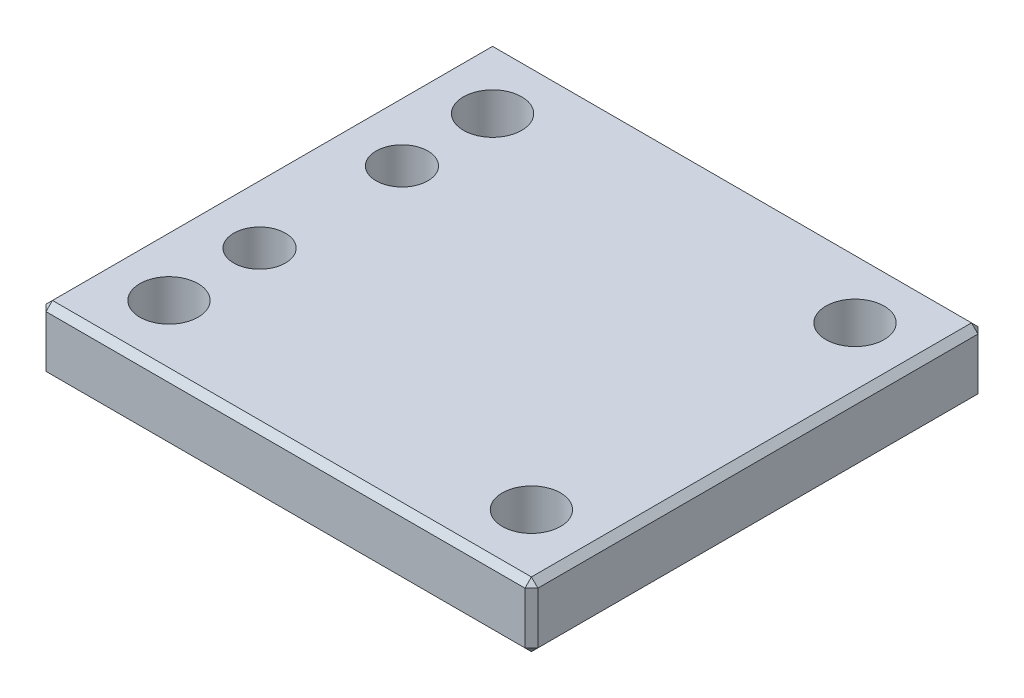
ISO-10303-21;
HEADER;
FILE_DESCRIPTION(('STEP AP214'),'2;1');
FILE_NAME('part.step','',(''),(''),'','','');
FILE_SCHEMA(('AUTOMOTIVE_DESIGN { 1 0 10303 214 1 1 1 1 }'));
ENDSEC;
DATA;
#1=APPLICATION_CONTEXT('core data for automotive mechanical design processes');
#2=APPLICATION_PROTOCOL_DEFINITION('international standard','automotive_design',2000,#1);
#3=PRODUCT_CONTEXT('',#1,'mechanical');
#4=PRODUCT('Part','Part','',(#3));
#5=PRODUCT_RELATED_PRODUCT_CATEGORY('part','',(#4));
#6=PRODUCT_DEFINITION_FORMATION('','',#4);
#7=PRODUCT_DEFINITION_CONTEXT('part definition',#1,'design');
#8=PRODUCT_DEFINITION('design','',#6,#7);
#9=PRODUCT_DEFINITION_SHAPE('','',#8);
#10=(LENGTH_UNIT() NAMED_UNIT(*) SI_UNIT(.MILLI.,.METRE.));
#11=(NAMED_UNIT(*) PLANE_ANGLE_UNIT() SI_UNIT($,.RADIAN.));
#12=(NAMED_UNIT(*) SI_UNIT($,.STERADIAN.) SOLID_ANGLE_UNIT());
#13=UNCERTAINTY_MEASURE_WITH_UNIT(LENGTH_MEASURE(1.E-05),#10,'distance_accuracy_value','');
#14=(GEOMETRIC_REPRESENTATION_CONTEXT(3) GLOBAL_UNCERTAINTY_ASSIGNED_CONTEXT((#13)) GLOBAL_UNIT_ASSIGNED_CONTEXT((#10,
#11,#12)) REPRESENTATION_CONTEXT('',''));
#15=CARTESIAN_POINT('',(0.,0.,0.));
#16=DIRECTION('',(0.,0.,1.));
#17=DIRECTION('',(1.,0.,0.));
#18=AXIS2_PLACEMENT_3D('',#15,#16,#17);
#19=CARTESIAN_POINT('',(0.,5.,0.));
#20=DIRECTION('',(1.,0.,0.));
#21=DIRECTION('',(0.,0.,-1.));
#22=AXIS2_PLACEMENT_3D('',#19,#20,#21);
#23=PLANE('',#22);
#24=DIRECTION('',(0.,-1.,0.));
#25=VECTOR('',#24,1.);
#26=CARTESIAN_POINT('',(0.,5.,-34.5));
#27=LINE('',#26,#25);
#28=CARTESIAN_POINT('',(0.,4.5,-34.5));
#29=VERTEX_POINT('',#28);
#30=CARTESIAN_POINT('',(0.,0.5,-34.5));
#31=VERTEX_POINT('',#30);
#32=EDGE_CURVE('E144',#29,#31,#27,.T.);
#33=ORIENTED_EDGE('',*,*,#32,.T.);
#34=DIRECTION('',(0.,0.,1.));
#35=VECTOR('',#34,1.);
#36=CARTESIAN_POINT('',(0.,0.5,0.));
#37=LINE('',#36,#35);
#38=CARTESIAN_POINT('',(0.,0.5,-0.5));
#39=VERTEX_POINT('',#38);
#40=EDGE_CURVE('E185',#31,#39,#37,.T.);
#41=ORIENTED_EDGE('',*,*,#40,.T.);
#42=DIRECTION('',(0.,1.,0.));
#43=VECTOR('',#42,1.);
#44=CARTESIAN_POINT('',(0.,5.,-0.5));
#45=LINE('',#44,#43);
#46=CARTESIAN_POINT('',(0.,4.5,-0.5));
#47=VERTEX_POINT('',#46);
#48=EDGE_CURVE('E182',#39,#47,#45,.T.);
#49=ORIENTED_EDGE('',*,*,#48,.T.);
#50=DIRECTION('',(0.,0.,-1.));
#51=VECTOR('',#50,1.);
#52=CARTESIAN_POINT('',(0.,4.5,0.));
#53=LINE('',#52,#51);
#54=EDGE_CURVE('E180',#47,#29,#53,.T.);
#55=ORIENTED_EDGE('',*,*,#54,.T.);
#56=EDGE_LOOP('',(#33,#41,#49,#55));
#57=FACE_BOUND('',#56,.T.);
#58=ADVANCED_FACE('F36',(#57),#23,.F.);
#59=CARTESIAN_POINT('',(0.,5.,0.));
#60=DIRECTION('',(0.,0.,-1.));
#61=DIRECTION('',(-1.,0.,0.));
#62=AXIS2_PLACEMENT_3D('',#59,#60,#61);
#63=PLANE('',#62);
#64=DIRECTION('',(-1.,0.,0.));
#65=VECTOR('',#64,1.);
#66=CARTESIAN_POINT('',(0.,4.5,0.));
#67=LINE('',#66,#65);
#68=CARTESIAN_POINT('',(37.5,4.5,0.));
#69=VERTEX_POINT('',#68);
#70=CARTESIAN_POINT('',(0.499999999999994,4.5,0.));
#71=VERTEX_POINT('',#70);
#72=EDGE_CURVE('E187',#69,#71,#67,.T.);
#73=ORIENTED_EDGE('',*,*,#72,.T.);
#74=DIRECTION('',(0.,-1.,0.));
#75=VECTOR('',#74,1.);
#76=CARTESIAN_POINT('',(0.499999999999994,5.,0.));
#77=LINE('',#76,#75);
#78=CARTESIAN_POINT('',(0.499999999999994,0.499999999999994,0.));
#79=VERTEX_POINT('',#78);
#80=EDGE_CURVE('E193',#71,#79,#77,.T.);
#81=ORIENTED_EDGE('',*,*,#80,.T.);
#82=DIRECTION('',(1.,0.,0.));
#83=VECTOR('',#82,1.);
#84=CARTESIAN_POINT('',(38.,0.499999999999994,0.));
#85=LINE('',#84,#83);
#86=CARTESIAN_POINT('',(37.5,0.499999999999994,0.));
#87=VERTEX_POINT('',#86);
#88=EDGE_CURVE('E191',#79,#87,#85,.T.);
#89=ORIENTED_EDGE('',*,*,#88,.T.);
#90=DIRECTION('',(0.,1.,0.));
#91=VECTOR('',#90,1.);
#92=CARTESIAN_POINT('',(37.5,5.,0.));
#93=LINE('',#92,#91);
#94=EDGE_CURVE('E189',#87,#69,#93,.T.);
#95=ORIENTED_EDGE('',*,*,#94,.T.);
#96=EDGE_LOOP('',(#73,#81,#89,#95));
#97=FACE_BOUND('',#96,.T.);
#98=ADVANCED_FACE('F300',(#97),#63,.F.);
#99=CARTESIAN_POINT('',(38.,5.,0.));
#100=DIRECTION('',(-1.,0.,0.));
#101=DIRECTION('',(0.,0.,1.));
#102=AXIS2_PLACEMENT_3D('',#99,#100,#101);
#103=PLANE('',#102);
#104=DIRECTION('',(0.,0.,-1.));
#105=VECTOR('',#104,1.);
#106=CARTESIAN_POINT('',(38.,0.499999999999994,-35.));
#107=LINE('',#106,#105);
#108=CARTESIAN_POINT('',(38.,0.499999999999994,-0.499999999999994));
#109=VERTEX_POINT('',#108);
#110=CARTESIAN_POINT('',(38.,0.499999999999994,-34.5));
#111=VERTEX_POINT('',#110);
#112=EDGE_CURVE('E175',#109,#111,#107,.T.);
#113=ORIENTED_EDGE('',*,*,#112,.T.);
#114=DIRECTION('',(0.,1.,0.));
#115=VECTOR('',#114,1.);
#116=CARTESIAN_POINT('',(38.,5.,-34.5));
#117=LINE('',#116,#115);
#118=CARTESIAN_POINT('',(38.,4.5,-34.5));
#119=VERTEX_POINT('',#118);
#120=EDGE_CURVE('E177',#111,#119,#117,.T.);
#121=ORIENTED_EDGE('',*,*,#120,.T.);
#122=DIRECTION('',(0.,0.,1.));
#123=VECTOR('',#122,1.);
#124=CARTESIAN_POINT('',(38.,4.5,0.));
#125=LINE('',#124,#123);
#126=CARTESIAN_POINT('',(38.,4.5,-0.499999999999994));
#127=VERTEX_POINT('',#126);
#128=EDGE_CURVE('E171',#119,#127,#125,.T.);
#129=ORIENTED_EDGE('',*,*,#128,.T.);
#130=DIRECTION('',(0.,-1.,0.));
#131=VECTOR('',#130,1.);
#132=CARTESIAN_POINT('',(38.,5.,-0.499999999999994));
#133=LINE('',#132,#131);
#134=EDGE_CURVE('E173',#127,#109,#133,.T.);
#135=ORIENTED_EDGE('',*,*,#134,.T.);
#136=EDGE_LOOP('',(#113,#121,#129,#135));
#137=FACE_BOUND('',#136,.T.);
#138=ADVANCED_FACE('F291',(#137),#103,.F.);
#139=CARTESIAN_POINT('',(0.,5.,-35.));
#140=DIRECTION('',(0.,0.,1.));
#141=DIRECTION('',(1.,0.,0.));
#142=AXIS2_PLACEMENT_3D('',#139,#140,#141);
#143=PLANE('',#142);
#144=DIRECTION('',(0.,-1.,0.));
#145=VECTOR('',#144,1.);
#146=CARTESIAN_POINT('',(37.5,5.,-35.));
#147=LINE('',#146,#145);
#148=CARTESIAN_POINT('',(37.5,4.5,-35.));
#149=VERTEX_POINT('',#148);
#150=CARTESIAN_POINT('',(37.5,0.499999999999994,-35.));
#151=VERTEX_POINT('',#150);
#152=EDGE_CURVE('E136',#149,#151,#147,.T.);
#153=ORIENTED_EDGE('',*,*,#152,.T.);
#154=DIRECTION('',(-1.,0.,0.));
#155=VECTOR('',#154,1.);
#156=CARTESIAN_POINT('',(0.,0.499999999999994,-35.));
#157=LINE('',#156,#155);
#158=CARTESIAN_POINT('',(0.499999999999994,0.499999999999994,-35.));
#159=VERTEX_POINT('',#158);
#160=EDGE_CURVE('E132',#151,#159,#157,.T.);
#161=ORIENTED_EDGE('',*,*,#160,.T.);
#162=DIRECTION('',(0.,1.,0.));
#163=VECTOR('',#162,1.);
#164=CARTESIAN_POINT('',(0.499999999999994,5.,-35.));
#165=LINE('',#164,#163);
#166=CARTESIAN_POINT('',(0.499999999999994,4.5,-35.));
#167=VERTEX_POINT('',#166);
#168=EDGE_CURVE('E124',#159,#167,#165,.T.);
#169=ORIENTED_EDGE('',*,*,#168,.T.);
#170=DIRECTION('',(1.,0.,0.));
#171=VECTOR('',#170,1.);
#172=CARTESIAN_POINT('',(0.,4.5,-35.));
#173=LINE('',#172,#171);
#174=EDGE_CURVE('E129',#167,#149,#173,.T.);
#175=ORIENTED_EDGE('',*,*,#174,.T.);
#176=EDGE_LOOP('',(#153,#161,#169,#175));
#177=FACE_BOUND('',#176,.T.);
#178=ADVANCED_FACE('F127',(#177),#143,.F.);
#179=CARTESIAN_POINT('',(0.,5.,-35.));
#180=DIRECTION('',(0.,-1.,0.));
#181=DIRECTION('',(0.,0.,-1.));
#182=AXIS2_PLACEMENT_3D('',#179,#180,#181);
#183=PLANE('',#182);
#184=CARTESIAN_POINT('',(5.00000000000653,5.,-22.9999999999998));
#185=DIRECTION('',(0.,-1.,0.));
#186=DIRECTION('',(0.,0.,-1.));
#187=AXIS2_PLACEMENT_3D('',#184,#185,#186);
#188=CIRCLE('',#187,2.);
#189=CARTESIAN_POINT('',(5.00000000000653,5.,-24.9999999999998));
#190=VERTEX_POINT('',#189);
#191=EDGE_CURVE('E658',#190,#190,#188,.T.);
#192=ORIENTED_EDGE('',*,*,#191,.T.);
#193=EDGE_LOOP('',(#192));
#194=FACE_BOUND('',#193,.T.);
#195=CARTESIAN_POINT('',(5.00000000000651,5.,-12.0000000000019));
#196=DIRECTION('',(0.,-1.,0.));
#197=DIRECTION('',(0.,0.,-1.));
#198=AXIS2_PLACEMENT_3D('',#195,#196,#197);
#199=CIRCLE('',#198,2.);
#200=CARTESIAN_POINT('',(5.00000000000651,5.,-14.0000000000019));
#201=VERTEX_POINT('',#200);
#202=EDGE_CURVE('E662',#201,#201,#199,.T.);
#203=ORIENTED_EDGE('',*,*,#202,.T.);
#204=EDGE_LOOP('',(#203));
#205=FACE_BOUND('',#204,.T.);
#206=CARTESIAN_POINT('',(33.,5.,-5.00000000000001));
#207=DIRECTION('',(0.,-1.,0.));
#208=DIRECTION('',(0.,0.,-1.));
#209=AXIS2_PLACEMENT_3D('',#206,#207,#208);
#210=CIRCLE('',#209,2.25);
#211=CARTESIAN_POINT('',(33.,5.,-7.25000000000001));
#212=VERTEX_POINT('',#211);
#213=EDGE_CURVE('E666',#212,#212,#210,.T.);
#214=ORIENTED_EDGE('',*,*,#213,.T.);
#215=EDGE_LOOP('',(#214));
#216=FACE_BOUND('',#215,.T.);
#217=CARTESIAN_POINT('',(33.,5.,-30.));
#218=DIRECTION('',(0.,-1.,0.));
#219=DIRECTION('',(0.,0.,-1.));
#220=AXIS2_PLACEMENT_3D('',#217,#218,#219);
#221=CIRCLE('',#220,2.25);
#222=CARTESIAN_POINT('',(33.,5.,-32.25));
#223=VERTEX_POINT('',#222);
#224=EDGE_CURVE('E670',#223,#223,#221,.T.);
#225=ORIENTED_EDGE('',*,*,#224,.T.);
#226=EDGE_LOOP('',(#225));
#227=FACE_BOUND('',#226,.T.);
#228=CARTESIAN_POINT('',(5.00000000000002,5.,-30.));
#229=DIRECTION('',(0.,-1.,0.));
#230=DIRECTION('',(0.,0.,-1.));
#231=AXIS2_PLACEMENT_3D('',#228,#229,#230);
#232=CIRCLE('',#231,2.25);
#233=CARTESIAN_POINT('',(5.00000000000002,5.,-32.25));
#234=VERTEX_POINT('',#233);
#235=EDGE_CURVE('E674',#234,#234,#232,.T.);
#236=ORIENTED_EDGE('',*,*,#235,.T.);
#237=EDGE_LOOP('',(#236));
#238=FACE_BOUND('',#237,.T.);
#239=CARTESIAN_POINT('',(5.00000000000001,5.,-5.00000000000001));
#240=DIRECTION('',(0.,-1.,0.));
#241=DIRECTION('',(0.,0.,-1.));
#242=AXIS2_PLACEMENT_3D('',#239,#240,#241);
#243=CIRCLE('',#242,2.25);
#244=CARTESIAN_POINT('',(5.00000000000001,5.,-7.25000000000001));
#245=VERTEX_POINT('',#244);
#246=EDGE_CURVE('E212',#245,#245,#243,.T.);
#247=ORIENTED_EDGE('',*,*,#246,.T.);
#248=EDGE_LOOP('',(#247));
#249=FACE_BOUND('',#248,.T.);
#250=DIRECTION('',(0.,0.,-1.));
#251=VECTOR('',#250,1.);
#252=CARTESIAN_POINT('',(37.5,5.,-35.));
#253=LINE('',#252,#251);
#254=CARTESIAN_POINT('',(37.5,5.,-0.499999999999994));
#255=VERTEX_POINT('',#254);
#256=CARTESIAN_POINT('',(37.5,5.,-34.5));
#257=VERTEX_POINT('',#256);
#258=EDGE_CURVE('E45',#255,#257,#253,.T.);
#259=ORIENTED_EDGE('',*,*,#258,.T.);
#260=DIRECTION('',(-1.,0.,0.));
#261=VECTOR('',#260,1.);
#262=CARTESIAN_POINT('',(0.,5.,-34.5));
#263=LINE('',#262,#261);
#264=CARTESIAN_POINT('',(0.499999999999994,5.,-34.5));
#265=VERTEX_POINT('',#264);
#266=EDGE_CURVE('E11',#257,#265,#263,.T.);
#267=ORIENTED_EDGE('',*,*,#266,.T.);
#268=DIRECTION('',(0.,0.,1.));
#269=VECTOR('',#268,1.);
#270=CARTESIAN_POINT('',(0.499999999999994,5.,-35.));
#271=LINE('',#270,#269);
#272=CARTESIAN_POINT('',(0.499999999999994,5.,-0.499999999999994));
#273=VERTEX_POINT('',#272);
#274=EDGE_CURVE('E205',#265,#273,#271,.T.);
#275=ORIENTED_EDGE('',*,*,#274,.T.);
#276=DIRECTION('',(1.,0.,0.));
#277=VECTOR('',#276,1.);
#278=CARTESIAN_POINT('',(0.,5.,-0.499999999999994));
#279=LINE('',#278,#277);
#280=EDGE_CURVE('E56',#273,#255,#279,.T.);
#281=ORIENTED_EDGE('',*,*,#280,.T.);
#282=EDGE_LOOP('',(#259,#267,#275,#281));
#283=FACE_BOUND('',#282,.T.);
#284=ADVANCED_FACE('F313',(#194,#205,#216,#227,#238,#249,#283),#183,.F.);
#285=CARTESIAN_POINT('',(0.,0.,-35.));
#286=DIRECTION('',(0.,-1.,0.));
#287=DIRECTION('',(0.,0.,-1.));
#288=AXIS2_PLACEMENT_3D('',#285,#286,#287);
#289=PLANE('',#288);
#290=CARTESIAN_POINT('',(5.00000000000653,0.,-22.9999999999998));
#291=DIRECTION('',(0.,-1.,0.));
#292=DIRECTION('',(0.,0.,-1.));
#293=AXIS2_PLACEMENT_3D('',#290,#291,#292);
#294=CIRCLE('',#293,2.);
#295=CARTESIAN_POINT('',(5.00000000000653,0.,-24.9999999999998));
#296=VERTEX_POINT('',#295);
#297=EDGE_CURVE('E695',#296,#296,#294,.T.);
#298=ORIENTED_EDGE('',*,*,#297,.F.);
#299=EDGE_LOOP('',(#298));
#300=FACE_BOUND('',#299,.T.);
#301=CARTESIAN_POINT('',(5.00000000000651,0.,-12.0000000000019));
#302=DIRECTION('',(0.,-1.,0.));
#303=DIRECTION('',(0.,0.,-1.));
#304=AXIS2_PLACEMENT_3D('',#301,#302,#303);
#305=CIRCLE('',#304,2.);
#306=CARTESIAN_POINT('',(5.00000000000651,0.,-14.0000000000019));
#307=VERTEX_POINT('',#306);
#308=EDGE_CURVE('E691',#307,#307,#305,.T.);
#309=ORIENTED_EDGE('',*,*,#308,.F.);
#310=EDGE_LOOP('',(#309));
#311=FACE_BOUND('',#310,.T.);
#312=CARTESIAN_POINT('',(33.,0.,-5.00000000000001));
#313=DIRECTION('',(0.,-1.,0.));
#314=DIRECTION('',(0.,0.,-1.));
#315=AXIS2_PLACEMENT_3D('',#312,#313,#314);
#316=CIRCLE('',#315,2.25);
#317=CARTESIAN_POINT('',(33.,0.,-7.25000000000001));
#318=VERTEX_POINT('',#317);
#319=EDGE_CURVE('E687',#318,#318,#316,.T.);
#320=ORIENTED_EDGE('',*,*,#319,.F.);
#321=EDGE_LOOP('',(#320));
#322=FACE_BOUND('',#321,.T.);
#323=CARTESIAN_POINT('',(33.,0.,-30.));
#324=DIRECTION('',(0.,-1.,0.));
#325=DIRECTION('',(0.,0.,-1.));
#326=AXIS2_PLACEMENT_3D('',#323,#324,#325);
#327=CIRCLE('',#326,2.25);
#328=CARTESIAN_POINT('',(33.,0.,-32.25));
#329=VERTEX_POINT('',#328);
#330=EDGE_CURVE('E683',#329,#329,#327,.T.);
#331=ORIENTED_EDGE('',*,*,#330,.F.);
#332=EDGE_LOOP('',(#331));
#333=FACE_BOUND('',#332,.T.);
#334=CARTESIAN_POINT('',(5.00000000000002,0.,-30.));
#335=DIRECTION('',(0.,-1.,0.));
#336=DIRECTION('',(0.,0.,-1.));
#337=AXIS2_PLACEMENT_3D('',#334,#335,#336);
#338=CIRCLE('',#337,2.25);
#339=CARTESIAN_POINT('',(5.00000000000002,0.,-32.25));
#340=VERTEX_POINT('',#339);
#341=EDGE_CURVE('E679',#340,#340,#338,.T.);
#342=ORIENTED_EDGE('',*,*,#341,.F.);
#343=EDGE_LOOP('',(#342));
#344=FACE_BOUND('',#343,.T.);
#345=CARTESIAN_POINT('',(5.00000000000001,0.,-5.00000000000001));
#346=DIRECTION('',(0.,-1.,0.));
#347=DIRECTION('',(0.,0.,-1.));
#348=AXIS2_PLACEMENT_3D('',#345,#346,#347);
#349=CIRCLE('',#348,2.25);
#350=CARTESIAN_POINT('',(5.00000000000001,0.,-7.25000000000001));
#351=VERTEX_POINT('',#350);
#352=EDGE_CURVE('E166',#351,#351,#349,.T.);
#353=ORIENTED_EDGE('',*,*,#352,.F.);
#354=EDGE_LOOP('',(#353));
#355=FACE_BOUND('',#354,.T.);
#356=DIRECTION('',(0.,0.,1.));
#357=VECTOR('',#356,1.);
#358=CARTESIAN_POINT('',(37.5,0.,0.));
#359=LINE('',#358,#357);
#360=CARTESIAN_POINT('',(37.5,0.,-34.5));
#361=VERTEX_POINT('',#360);
#362=CARTESIAN_POINT('',(37.5,0.,-0.5));
#363=VERTEX_POINT('',#362);
#364=EDGE_CURVE('E196',#361,#363,#359,.T.);
#365=ORIENTED_EDGE('',*,*,#364,.T.);
#366=DIRECTION('',(-1.,0.,0.));
#367=VECTOR('',#366,1.);
#368=CARTESIAN_POINT('',(0.,0.,-0.5));
#369=LINE('',#368,#367);
#370=CARTESIAN_POINT('',(0.499999999999994,0.,-0.5));
#371=VERTEX_POINT('',#370);
#372=EDGE_CURVE('E202',#363,#371,#369,.T.);
#373=ORIENTED_EDGE('',*,*,#372,.T.);
#374=DIRECTION('',(0.,0.,-1.));
#375=VECTOR('',#374,1.);
#376=CARTESIAN_POINT('',(0.499999999999994,0.,-35.));
#377=LINE('',#376,#375);
#378=CARTESIAN_POINT('',(0.499999999999994,0.,-34.5));
#379=VERTEX_POINT('',#378);
#380=EDGE_CURVE('E200',#371,#379,#377,.T.);
#381=ORIENTED_EDGE('',*,*,#380,.T.);
#382=DIRECTION('',(1.,0.,0.));
#383=VECTOR('',#382,1.);
#384=CARTESIAN_POINT('',(38.,0.,-34.5));
#385=LINE('',#384,#383);
#386=EDGE_CURVE('E198',#379,#361,#385,.T.);
#387=ORIENTED_EDGE('',*,*,#386,.T.);
#388=EDGE_LOOP('',(#365,#373,#381,#387));
#389=FACE_BOUND('',#388,.T.);
#390=ADVANCED_FACE('F273',(#300,#311,#322,#333,#344,#355,#389),#289,.T.);
#391=CARTESIAN_POINT('',(0.499999999999994,5.,0.));
#392=DIRECTION('',(0.707106781186552,0.,-0.707106781186543));
#393=DIRECTION('',(-0.707106781186543,0.,-0.707106781186552));
#394=AXIS2_PLACEMENT_3D('',#391,#392,#393);
#395=PLANE('',#394);
#396=DIRECTION('',(-0.707106781186543,0.,-0.707106781186552));
#397=VECTOR('',#396,1.);
#398=CARTESIAN_POINT('',(0.,4.5,-0.5));
#399=LINE('',#398,#397);
#400=EDGE_CURVE('E40',#47,#71,#399,.F.);
#401=ORIENTED_EDGE('',*,*,#400,.F.);
#402=ORIENTED_EDGE('',*,*,#48,.F.);
#403=DIRECTION('',(0.707106781186543,0.,0.707106781186552));
#404=VECTOR('',#403,1.);
#405=CARTESIAN_POINT('',(0.499999999999994,0.499999999999994,0.));
#406=LINE('',#405,#404);
#407=EDGE_CURVE('E164',#79,#39,#406,.F.);
#408=ORIENTED_EDGE('',*,*,#407,.F.);
#409=ORIENTED_EDGE('',*,*,#80,.F.);
#410=EDGE_LOOP('',(#401,#402,#408,#409));
#411=FACE_BOUND('',#410,.T.);
#412=ADVANCED_FACE('F38',(#411),#395,.F.);
#413=CARTESIAN_POINT('',(0.,4.5,-0.5));
#414=DIRECTION('',(-0.577350269189634,0.577350269189618,0.577350269189626));
#415=DIRECTION('',(0.707106781186543,0.,0.707106781186552));
#416=AXIS2_PLACEMENT_3D('',#413,#414,#415);
#417=PLANE('',#416);
#418=DIRECTION('',(0.707106781186543,0.707106781186552,0.));
#419=VECTOR('',#418,1.);
#420=CARTESIAN_POINT('',(0.,4.5,-0.5));
#421=LINE('',#420,#419);
#422=EDGE_CURVE('E253',#47,#273,#421,.T.);
#423=ORIENTED_EDGE('',*,*,#422,.F.);
#424=ORIENTED_EDGE('',*,*,#400,.T.);
#425=DIRECTION('',(0.,-0.707106781186552,0.707106781186543));
#426=VECTOR('',#425,1.);
#427=CARTESIAN_POINT('',(0.499999999999994,4.75,-0.249999999999997));
#428=LINE('',#427,#426);
#429=EDGE_CURVE('E256',#273,#71,#428,.T.);
#430=ORIENTED_EDGE('',*,*,#429,.F.);
#431=EDGE_LOOP('',(#423,#424,#430));
#432=FACE_BOUND('',#431,.T.);
#433=ADVANCED_FACE('F307',(#432),#417,.T.);
#434=CARTESIAN_POINT('',(0.499999999999994,0.499999999999994,0.));
#435=DIRECTION('',(-0.577350269189634,-0.577350269189626,0.577350269189618));
#436=DIRECTION('',(0.707106781186543,-0.707106781186552,0.));
#437=AXIS2_PLACEMENT_3D('',#434,#435,#436);
#438=PLANE('',#437);
#439=DIRECTION('',(0.,0.707106781186543,0.707106781186552));
#440=VECTOR('',#439,1.);
#441=CARTESIAN_POINT('',(0.499999999999994,0.499999999999994,0.));
#442=LINE('',#441,#440);
#443=EDGE_CURVE('E247',#79,#371,#442,.F.);
#444=ORIENTED_EDGE('',*,*,#443,.F.);
#445=ORIENTED_EDGE('',*,*,#407,.T.);
#446=DIRECTION('',(0.707106781186543,-0.707106781186552,0.));
#447=VECTOR('',#446,1.);
#448=CARTESIAN_POINT('',(0.249999999999997,0.25,-0.5));
#449=LINE('',#448,#447);
#450=EDGE_CURVE('E250',#371,#39,#449,.F.);
#451=ORIENTED_EDGE('',*,*,#450,.F.);
#452=EDGE_LOOP('',(#444,#445,#451));
#453=FACE_BOUND('',#452,.T.);
#454=ADVANCED_FACE('F263',(#453),#438,.T.);
#455=CARTESIAN_POINT('',(0.,5.,-0.499999999999994));
#456=DIRECTION('',(0.,-0.707106781186543,-0.707106781186552));
#457=DIRECTION('',(0.,0.707106781186552,-0.707106781186543));
#458=AXIS2_PLACEMENT_3D('',#455,#456,#457);
#459=PLANE('',#458);
#460=ORIENTED_EDGE('',*,*,#429,.T.);
#461=ORIENTED_EDGE('',*,*,#72,.F.);
#462=DIRECTION('',(0.,0.707106781186552,-0.707106781186543));
#463=VECTOR('',#462,1.);
#464=CARTESIAN_POINT('',(37.5,4.5,0.));
#465=LINE('',#464,#463);
#466=EDGE_CURVE('E241',#255,#69,#465,.F.);
#467=ORIENTED_EDGE('',*,*,#466,.F.);
#468=ORIENTED_EDGE('',*,*,#280,.F.);
#469=EDGE_LOOP('',(#460,#461,#467,#468));
#470=FACE_BOUND('',#469,.T.);
#471=ADVANCED_FACE('F302',(#470),#459,.F.);
#472=CARTESIAN_POINT('',(0.499999999999994,5.,-35.));
#473=DIRECTION('',(0.707106781186552,-0.707106781186543,0.));
#474=DIRECTION('',(0.707106781186543,0.707106781186552,0.));
#475=AXIS2_PLACEMENT_3D('',#472,#473,#474);
#476=PLANE('',#475);
#477=ORIENTED_EDGE('',*,*,#422,.T.);
#478=ORIENTED_EDGE('',*,*,#274,.F.);
#479=DIRECTION('',(-0.707106781186543,-0.707106781186552,0.));
#480=VECTOR('',#479,1.);
#481=CARTESIAN_POINT('',(0.249999999999997,4.75,-34.5));
#482=LINE('',#481,#480);
#483=EDGE_CURVE('E148',#29,#265,#482,.F.);
#484=ORIENTED_EDGE('',*,*,#483,.F.);
#485=ORIENTED_EDGE('',*,*,#54,.F.);
#486=EDGE_LOOP('',(#477,#478,#484,#485));
#487=FACE_BOUND('',#486,.T.);
#488=ADVANCED_FACE('F312',(#487),#476,.F.);
#489=CARTESIAN_POINT('',(0.,5.,-34.5));
#490=DIRECTION('',(0.707106781186552,0.,0.707106781186543));
#491=DIRECTION('',(0.707106781186543,0.,-0.707106781186552));
#492=AXIS2_PLACEMENT_3D('',#489,#490,#491);
#493=PLANE('',#492);
#494=DIRECTION('',(-0.707106781186543,0.,0.707106781186552));
#495=VECTOR('',#494,1.);
#496=CARTESIAN_POINT('',(0.,0.5,-34.5));
#497=LINE('',#496,#495);
#498=EDGE_CURVE('E149',#31,#159,#497,.F.);
#499=ORIENTED_EDGE('',*,*,#498,.F.);
#500=ORIENTED_EDGE('',*,*,#32,.F.);
#501=DIRECTION('',(0.707106781186543,0.,-0.707106781186552));
#502=VECTOR('',#501,1.);
#503=CARTESIAN_POINT('',(0.499999999999994,4.5,-35.));
#504=LINE('',#503,#502);
#505=EDGE_CURVE('E140',#167,#29,#504,.F.);
#506=ORIENTED_EDGE('',*,*,#505,.F.);
#507=ORIENTED_EDGE('',*,*,#168,.F.);
#508=EDGE_LOOP('',(#499,#500,#506,#507));
#509=FACE_BOUND('',#508,.T.);
#510=ADVANCED_FACE('F142',(#509),#493,.F.);
#511=CARTESIAN_POINT('',(0.,0.5,0.));
#512=DIRECTION('',(-0.707106781186552,-0.707106781186543,0.));
#513=DIRECTION('',(0.707106781186543,-0.707106781186552,0.));
#514=AXIS2_PLACEMENT_3D('',#511,#512,#513);
#515=PLANE('',#514);
#516=ORIENTED_EDGE('',*,*,#450,.T.);
#517=ORIENTED_EDGE('',*,*,#40,.F.);
#518=DIRECTION('',(-0.707106781186543,0.707106781186552,0.));
#519=VECTOR('',#518,1.);
#520=CARTESIAN_POINT('',(0.,0.5,-34.5));
#521=LINE('',#520,#519);
#522=EDGE_CURVE('E237',#379,#31,#521,.T.);
#523=ORIENTED_EDGE('',*,*,#522,.F.);
#524=ORIENTED_EDGE('',*,*,#380,.F.);
#525=EDGE_LOOP('',(#516,#517,#523,#524));
#526=FACE_BOUND('',#525,.T.);
#527=ADVANCED_FACE('F269',(#526),#515,.T.);
#528=CARTESIAN_POINT('',(0.,0.499999999999994,0.));
#529=DIRECTION('',(0.,-0.707106781186552,0.707106781186543));
#530=DIRECTION('',(0.,-0.707106781186543,-0.707106781186552));
#531=AXIS2_PLACEMENT_3D('',#528,#529,#530);
#532=PLANE('',#531);
#533=ORIENTED_EDGE('',*,*,#443,.T.);
#534=ORIENTED_EDGE('',*,*,#372,.F.);
#535=DIRECTION('',(0.,-0.707106781186543,-0.707106781186552));
#536=VECTOR('',#535,1.);
#537=CARTESIAN_POINT('',(37.5,0.499999999999994,0.));
#538=LINE('',#537,#536);
#539=EDGE_CURVE('E234',#87,#363,#538,.T.);
#540=ORIENTED_EDGE('',*,*,#539,.F.);
#541=ORIENTED_EDGE('',*,*,#88,.F.);
#542=EDGE_LOOP('',(#533,#534,#540,#541));
#543=FACE_BOUND('',#542,.T.);
#544=ADVANCED_FACE('F279',(#543),#532,.T.);
#545=CARTESIAN_POINT('',(38.,5.,-0.499999999999994));
#546=DIRECTION('',(-0.707106781186543,0.,-0.707106781186552));
#547=DIRECTION('',(-0.707106781186552,0.,0.707106781186543));
#548=AXIS2_PLACEMENT_3D('',#545,#546,#547);
#549=PLANE('',#548);
#550=DIRECTION('',(-0.707106781186552,0.,0.707106781186543));
#551=VECTOR('',#550,1.);
#552=CARTESIAN_POINT('',(37.5,4.5,0.));
#553=LINE('',#552,#551);
#554=EDGE_CURVE('E244',#69,#127,#553,.F.);
#555=ORIENTED_EDGE('',*,*,#554,.F.);
#556=ORIENTED_EDGE('',*,*,#94,.F.);
#557=DIRECTION('',(0.707106781186552,0.,-0.707106781186543));
#558=VECTOR('',#557,1.);
#559=CARTESIAN_POINT('',(37.5,0.499999999999994,0.));
#560=LINE('',#559,#558);
#561=EDGE_CURVE('E231',#109,#87,#560,.F.);
#562=ORIENTED_EDGE('',*,*,#561,.F.);
#563=ORIENTED_EDGE('',*,*,#134,.F.);
#564=EDGE_LOOP('',(#555,#556,#562,#563));
#565=FACE_BOUND('',#564,.T.);
#566=ADVANCED_FACE('F297',(#565),#549,.F.);
#567=CARTESIAN_POINT('',(37.5,4.5,0.));
#568=DIRECTION('',(0.577350269189626,0.577350269189618,0.577350269189634));
#569=DIRECTION('',(0.707106781186552,0.,-0.707106781186543));
#570=AXIS2_PLACEMENT_3D('',#567,#568,#569);
#571=PLANE('',#570);
#572=ORIENTED_EDGE('',*,*,#466,.T.);
#573=ORIENTED_EDGE('',*,*,#554,.T.);
#574=DIRECTION('',(0.707106781186543,-0.707106781186552,0.));
#575=VECTOR('',#574,1.);
#576=CARTESIAN_POINT('',(37.75,4.75,-0.499999999999994));
#577=LINE('',#576,#575);
#578=EDGE_CURVE('E155',#255,#127,#577,.T.);
#579=ORIENTED_EDGE('',*,*,#578,.F.);
#580=EDGE_LOOP('',(#572,#573,#579));
#581=FACE_BOUND('',#580,.T.);
#582=ADVANCED_FACE('F336',(#581),#571,.T.);
#583=CARTESIAN_POINT('',(0.499999999999994,4.5,-35.));
#584=DIRECTION('',(-0.577350269189634,0.577350269189618,-0.577350269189626));
#585=DIRECTION('',(-0.707106781186543,0.,0.707106781186552));
#586=AXIS2_PLACEMENT_3D('',#583,#584,#585);
#587=PLANE('',#586);
#588=ORIENTED_EDGE('',*,*,#505,.T.);
#589=ORIENTED_EDGE('',*,*,#483,.T.);
#590=DIRECTION('',(0.,0.707106781186552,0.707106781186543));
#591=VECTOR('',#590,1.);
#592=CARTESIAN_POINT('',(0.499999999999994,4.5,-35.));
#593=LINE('',#592,#591);
#594=EDGE_CURVE('E151',#167,#265,#593,.T.);
#595=ORIENTED_EDGE('',*,*,#594,.F.);
#596=EDGE_LOOP('',(#588,#589,#595));
#597=FACE_BOUND('',#596,.T.);
#598=ADVANCED_FACE('F152',(#597),#587,.T.);
#599=CARTESIAN_POINT('',(0.,0.5,-34.5));
#600=DIRECTION('',(-0.577350269189634,-0.577350269189626,-0.577350269189618));
#601=DIRECTION('',(0.707106781186543,-0.707106781186552,0.));
#602=AXIS2_PLACEMENT_3D('',#599,#600,#601);
#603=PLANE('',#602);
#604=ORIENTED_EDGE('',*,*,#522,.T.);
#605=ORIENTED_EDGE('',*,*,#498,.T.);
#606=DIRECTION('',(0.,-0.707106781186543,0.707106781186552));
#607=VECTOR('',#606,1.);
#608=CARTESIAN_POINT('',(0.499999999999994,0.249999999999997,-34.75));
#609=LINE('',#608,#607);
#610=EDGE_CURVE('E156',#379,#159,#609,.F.);
#611=ORIENTED_EDGE('',*,*,#610,.F.);
#612=EDGE_LOOP('',(#604,#605,#611));
#613=FACE_BOUND('',#612,.T.);
#614=ADVANCED_FACE('F328',(#613),#603,.T.);
#615=CARTESIAN_POINT('',(37.5,0.499999999999994,0.));
#616=DIRECTION('',(0.577350269189618,-0.577350269189634,0.577350269189626));
#617=DIRECTION('',(0.,-0.707106781186543,-0.707106781186552));
#618=AXIS2_PLACEMENT_3D('',#615,#616,#617);
#619=PLANE('',#618);
#620=ORIENTED_EDGE('',*,*,#561,.T.);
#621=ORIENTED_EDGE('',*,*,#539,.T.);
#622=DIRECTION('',(0.707106781186552,0.707106781186543,0.));
#623=VECTOR('',#622,1.);
#624=CARTESIAN_POINT('',(37.75,0.249999999999997,-0.499999999999997));
#625=LINE('',#624,#623);
#626=EDGE_CURVE('E224',#109,#363,#625,.F.);
#627=ORIENTED_EDGE('',*,*,#626,.F.);
#628=EDGE_LOOP('',(#620,#621,#627));
#629=FACE_BOUND('',#628,.T.);
#630=ADVANCED_FACE('F282',(#629),#619,.T.);
#631=CARTESIAN_POINT('',(37.5,5.,-35.));
#632=DIRECTION('',(-0.707106781186552,-0.707106781186543,0.));
#633=DIRECTION('',(0.707106781186543,-0.707106781186552,0.));
#634=AXIS2_PLACEMENT_3D('',#631,#632,#633);
#635=PLANE('',#634);
#636=ORIENTED_EDGE('',*,*,#578,.T.);
#637=ORIENTED_EDGE('',*,*,#128,.F.);
#638=DIRECTION('',(-0.707106781186543,0.707106781186552,0.));
#639=VECTOR('',#638,1.);
#640=CARTESIAN_POINT('',(38.,4.5,-34.5));
#641=LINE('',#640,#639);
#642=EDGE_CURVE('E221',#257,#119,#641,.F.);
#643=ORIENTED_EDGE('',*,*,#642,.F.);
#644=ORIENTED_EDGE('',*,*,#258,.F.);
#645=EDGE_LOOP('',(#636,#637,#643,#644));
#646=FACE_BOUND('',#645,.T.);
#647=ADVANCED_FACE('F316',(#646),#635,.F.);
#648=CARTESIAN_POINT('',(0.,5.,-34.5));
#649=DIRECTION('',(0.,-0.707106781186543,0.707106781186552));
#650=DIRECTION('',(0.,-0.707106781186552,-0.707106781186543));
#651=AXIS2_PLACEMENT_3D('',#648,#649,#650);
#652=PLANE('',#651);
#653=ORIENTED_EDGE('',*,*,#594,.T.);
#654=ORIENTED_EDGE('',*,*,#266,.F.);
#655=DIRECTION('',(0.,-0.707106781186552,-0.707106781186543));
#656=VECTOR('',#655,1.);
#657=CARTESIAN_POINT('',(37.5,4.75,-34.75));
#658=LINE('',#657,#656);
#659=EDGE_CURVE('E160',#149,#257,#658,.F.);
#660=ORIENTED_EDGE('',*,*,#659,.F.);
#661=ORIENTED_EDGE('',*,*,#174,.F.);
#662=EDGE_LOOP('',(#653,#654,#660,#661));
#663=FACE_BOUND('',#662,.T.);
#664=ADVANCED_FACE('F158',(#663),#652,.F.);
#665=CARTESIAN_POINT('',(0.,0.499999999999994,-35.));
#666=DIRECTION('',(0.,-0.707106781186552,-0.707106781186543));
#667=DIRECTION('',(0.,0.707106781186543,-0.707106781186552));
#668=AXIS2_PLACEMENT_3D('',#665,#666,#667);
#669=PLANE('',#668);
#670=ORIENTED_EDGE('',*,*,#610,.T.);
#671=ORIENTED_EDGE('',*,*,#160,.F.);
#672=DIRECTION('',(0.,0.707106781186543,-0.707106781186552));
#673=VECTOR('',#672,1.);
#674=CARTESIAN_POINT('',(37.5,0.499999999999994,-35.));
#675=LINE('',#674,#673);
#676=EDGE_CURVE('E217',#361,#151,#675,.T.);
#677=ORIENTED_EDGE('',*,*,#676,.F.);
#678=ORIENTED_EDGE('',*,*,#386,.F.);
#679=EDGE_LOOP('',(#670,#671,#677,#678));
#680=FACE_BOUND('',#679,.T.);
#681=ADVANCED_FACE('F326',(#680),#669,.T.);
#682=CARTESIAN_POINT('',(38.,0.499999999999994,0.));
#683=DIRECTION('',(0.707106781186543,-0.707106781186552,0.));
#684=DIRECTION('',(0.707106781186552,0.707106781186543,0.));
#685=AXIS2_PLACEMENT_3D('',#682,#683,#684);
#686=PLANE('',#685);
#687=ORIENTED_EDGE('',*,*,#626,.T.);
#688=ORIENTED_EDGE('',*,*,#364,.F.);
#689=DIRECTION('',(-0.707106781186552,-0.707106781186543,0.));
#690=VECTOR('',#689,1.);
#691=CARTESIAN_POINT('',(37.75,0.249999999999997,-34.5));
#692=LINE('',#691,#690);
#693=EDGE_CURVE('E214',#111,#361,#692,.T.);
#694=ORIENTED_EDGE('',*,*,#693,.F.);
#695=ORIENTED_EDGE('',*,*,#112,.F.);
#696=EDGE_LOOP('',(#687,#688,#694,#695));
#697=FACE_BOUND('',#696,.T.);
#698=ADVANCED_FACE('F286',(#697),#686,.T.);
#699=CARTESIAN_POINT('',(38.,4.5,-34.5));
#700=DIRECTION('',(0.577350269189634,0.577350269189618,-0.577350269189626));
#701=DIRECTION('',(-0.707106781186543,0.,-0.707106781186552));
#702=AXIS2_PLACEMENT_3D('',#699,#700,#701);
#703=PLANE('',#702);
#704=ORIENTED_EDGE('',*,*,#659,.T.);
#705=ORIENTED_EDGE('',*,*,#642,.T.);
#706=DIRECTION('',(0.707106781186543,0.,0.707106781186552));
#707=VECTOR('',#706,1.);
#708=CARTESIAN_POINT('',(38.,4.5,-34.5));
#709=LINE('',#708,#707);
#710=EDGE_CURVE('E211',#149,#119,#709,.T.);
#711=ORIENTED_EDGE('',*,*,#710,.F.);
#712=EDGE_LOOP('',(#704,#705,#711));
#713=FACE_BOUND('',#712,.T.);
#714=ADVANCED_FACE('F318',(#713),#703,.T.);
#715=CARTESIAN_POINT('',(37.5,0.499999999999994,-35.));
#716=DIRECTION('',(0.577350269189626,-0.577350269189634,-0.577350269189618));
#717=DIRECTION('',(0.707106781186552,0.707106781186543,0.));
#718=AXIS2_PLACEMENT_3D('',#715,#716,#717);
#719=PLANE('',#718);
#720=ORIENTED_EDGE('',*,*,#693,.T.);
#721=ORIENTED_EDGE('',*,*,#676,.T.);
#722=DIRECTION('',(-0.707106781186543,0.,-0.707106781186552));
#723=VECTOR('',#722,1.);
#724=CARTESIAN_POINT('',(37.5,0.499999999999994,-35.));
#725=LINE('',#724,#723);
#726=EDGE_CURVE('E209',#111,#151,#725,.T.);
#727=ORIENTED_EDGE('',*,*,#726,.F.);
#728=EDGE_LOOP('',(#720,#721,#727));
#729=FACE_BOUND('',#728,.T.);
#730=ADVANCED_FACE('F324',(#729),#719,.T.);
#731=CARTESIAN_POINT('',(37.5,5.,-35.));
#732=DIRECTION('',(-0.707106781186552,0.,0.707106781186543));
#733=DIRECTION('',(0.707106781186543,0.,0.707106781186552));
#734=AXIS2_PLACEMENT_3D('',#731,#732,#733);
#735=PLANE('',#734);
#736=ORIENTED_EDGE('',*,*,#710,.T.);
#737=ORIENTED_EDGE('',*,*,#120,.F.);
#738=ORIENTED_EDGE('',*,*,#726,.T.);
#739=ORIENTED_EDGE('',*,*,#152,.F.);
#740=EDGE_LOOP('',(#736,#737,#738,#739));
#741=FACE_BOUND('',#740,.T.);
#742=ADVANCED_FACE('F321',(#741),#735,.F.);
#743=CARTESIAN_POINT('',(5.00000000000001,5.,-5.00000000000001));
#744=DIRECTION('',(0.,-1.,0.));
#745=DIRECTION('',(0.,0.,-1.));
#746=AXIS2_PLACEMENT_3D('',#743,#744,#745);
#747=CYLINDRICAL_SURFACE('',#746,2.25);
#748=ORIENTED_EDGE('',*,*,#246,.F.);
#749=EDGE_LOOP('',(#748));
#750=FACE_BOUND('',#749,.T.);
#751=ORIENTED_EDGE('',*,*,#352,.T.);
#752=EDGE_LOOP('',(#751));
#753=FACE_BOUND('',#752,.T.);
#754=ADVANCED_FACE('F348',(#750,#753),#747,.F.);
#755=CARTESIAN_POINT('',(5.00000000000002,5.,-30.));
#756=DIRECTION('',(0.,-1.,0.));
#757=DIRECTION('',(0.,0.,-1.));
#758=AXIS2_PLACEMENT_3D('',#755,#756,#757);
#759=CYLINDRICAL_SURFACE('',#758,2.25);
#760=ORIENTED_EDGE('',*,*,#235,.F.);
#761=EDGE_LOOP('',(#760));
#762=FACE_BOUND('',#761,.T.);
#763=ORIENTED_EDGE('',*,*,#341,.T.);
#764=EDGE_LOOP('',(#763));
#765=FACE_BOUND('',#764,.T.);
#766=ADVANCED_FACE('F394',(#762,#765),#759,.F.);
#767=CARTESIAN_POINT('',(33.,5.,-30.));
#768=DIRECTION('',(0.,-1.,0.));
#769=DIRECTION('',(0.,0.,-1.));
#770=AXIS2_PLACEMENT_3D('',#767,#768,#769);
#771=CYLINDRICAL_SURFACE('',#770,2.25);
#772=ORIENTED_EDGE('',*,*,#224,.F.);
#773=EDGE_LOOP('',(#772));
#774=FACE_BOUND('',#773,.T.);
#775=ORIENTED_EDGE('',*,*,#330,.T.);
#776=EDGE_LOOP('',(#775));
#777=FACE_BOUND('',#776,.T.);
#778=ADVANCED_FACE('F402',(#774,#777),#771,.F.);
#779=CARTESIAN_POINT('',(33.,5.,-5.00000000000001));
#780=DIRECTION('',(0.,-1.,0.));
#781=DIRECTION('',(0.,0.,-1.));
#782=AXIS2_PLACEMENT_3D('',#779,#780,#781);
#783=CYLINDRICAL_SURFACE('',#782,2.25);
#784=ORIENTED_EDGE('',*,*,#213,.F.);
#785=EDGE_LOOP('',(#784));
#786=FACE_BOUND('',#785,.T.);
#787=ORIENTED_EDGE('',*,*,#319,.T.);
#788=EDGE_LOOP('',(#787));
#789=FACE_BOUND('',#788,.T.);
#790=ADVANCED_FACE('F410',(#786,#789),#783,.F.);
#791=CARTESIAN_POINT('',(5.00000000000651,5.,-12.0000000000019));
#792=DIRECTION('',(0.,-1.,0.));
#793=DIRECTION('',(0.,0.,-1.));
#794=AXIS2_PLACEMENT_3D('',#791,#792,#793);
#795=CYLINDRICAL_SURFACE('',#794,2.);
#796=ORIENTED_EDGE('',*,*,#202,.F.);
#797=EDGE_LOOP('',(#796));
#798=FACE_BOUND('',#797,.T.);
#799=ORIENTED_EDGE('',*,*,#308,.T.);
#800=EDGE_LOOP('',(#799));
#801=FACE_BOUND('',#800,.T.);
#802=ADVANCED_FACE('F418',(#798,#801),#795,.F.);
#803=CARTESIAN_POINT('',(5.00000000000653,5.,-22.9999999999998));
#804=DIRECTION('',(0.,-1.,0.));
#805=DIRECTION('',(0.,0.,-1.));
#806=AXIS2_PLACEMENT_3D('',#803,#804,#805);
#807=CYLINDRICAL_SURFACE('',#806,2.);
#808=ORIENTED_EDGE('',*,*,#191,.F.);
#809=EDGE_LOOP('',(#808));
#810=FACE_BOUND('',#809,.T.);
#811=ORIENTED_EDGE('',*,*,#297,.T.);
#812=EDGE_LOOP('',(#811));
#813=FACE_BOUND('',#812,.T.);
#814=ADVANCED_FACE('F426',(#810,#813),#807,.F.);
#815=CLOSED_SHELL('',(#58,#98,#138,#178,#284,#390,#412,#433,#454,#471,#488,#510,#527,#544,#566,
#582,#598,#614,#630,#647,#664,#681,#698,#714,#730,#742,#754,#766,#778,#790,#802,#814));
#816=MANIFOLD_SOLID_BREP('B2',#815);
#817=ADVANCED_BREP_SHAPE_REPRESENTATION('',(#18,#816),#14);
#818=SHAPE_DEFINITION_REPRESENTATION(#9,#817);
ENDSEC;
END-ISO-10303-21;
